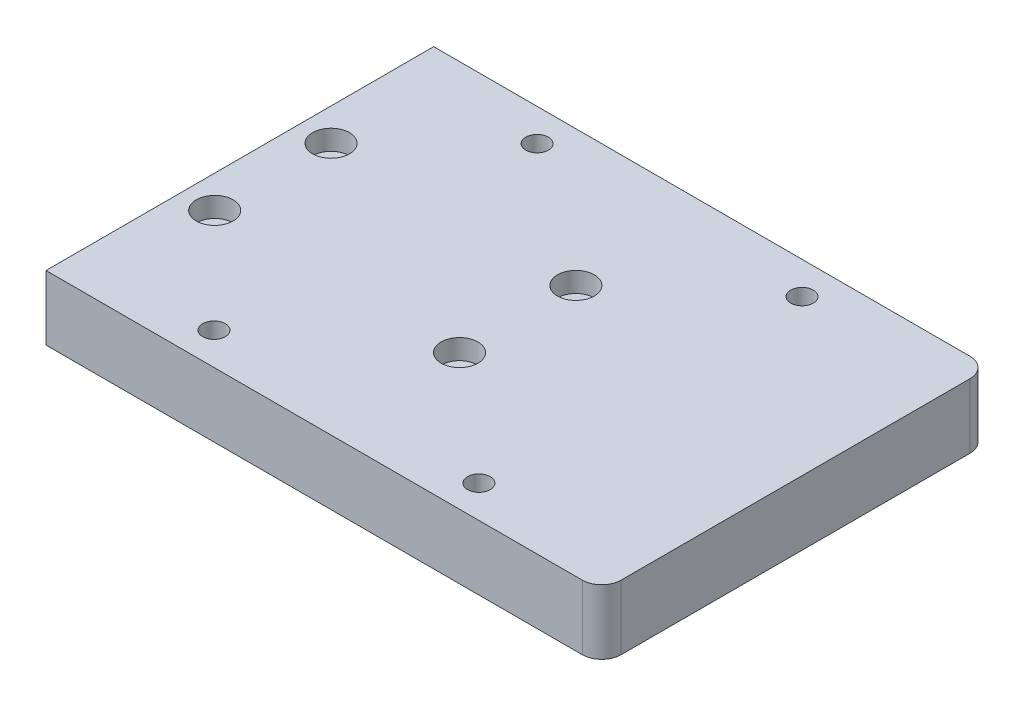
ISO-10303-21;
HEADER;
FILE_DESCRIPTION(('STEP AP214'),'2;1');
FILE_NAME('part.step','',(''),(''),'','','');
FILE_SCHEMA(('AUTOMOTIVE_DESIGN { 1 0 10303 214 1 1 1 1 }'));
ENDSEC;
DATA;
#1=APPLICATION_CONTEXT('core data for automotive mechanical design processes');
#2=APPLICATION_PROTOCOL_DEFINITION('international standard','automotive_design',2000,#1);
#3=PRODUCT_CONTEXT('',#1,'mechanical');
#4=PRODUCT('Part','Part','',(#3));
#5=PRODUCT_RELATED_PRODUCT_CATEGORY('part','',(#4));
#6=PRODUCT_DEFINITION_FORMATION('','',#4);
#7=PRODUCT_DEFINITION_CONTEXT('part definition',#1,'design');
#8=PRODUCT_DEFINITION('design','',#6,#7);
#9=PRODUCT_DEFINITION_SHAPE('','',#8);
#10=(LENGTH_UNIT() NAMED_UNIT(*) SI_UNIT(.MILLI.,.METRE.));
#11=(NAMED_UNIT(*) PLANE_ANGLE_UNIT() SI_UNIT($,.RADIAN.));
#12=(NAMED_UNIT(*) SI_UNIT($,.STERADIAN.) SOLID_ANGLE_UNIT());
#13=UNCERTAINTY_MEASURE_WITH_UNIT(LENGTH_MEASURE(1.E-05),#10,'distance_accuracy_value','');
#14=(GEOMETRIC_REPRESENTATION_CONTEXT(3) GLOBAL_UNCERTAINTY_ASSIGNED_CONTEXT((#13)) GLOBAL_UNIT_ASSIGNED_CONTEXT((#10,
#11,#12)) REPRESENTATION_CONTEXT('',''));
#15=CARTESIAN_POINT('',(0.,0.,0.));
#16=DIRECTION('',(0.,0.,1.));
#17=DIRECTION('',(1.,0.,0.));
#18=AXIS2_PLACEMENT_3D('',#15,#16,#17);
#19=CARTESIAN_POINT('',(-38.,0.,8.88983487013223));
#20=DIRECTION('',(0.,1.,0.));
#21=DIRECTION('',(0.,0.,1.));
#22=AXIS2_PLACEMENT_3D('',#19,#20,#21);
#23=CYLINDRICAL_SURFACE('',#22,1.25);
#24=CARTESIAN_POINT('',(-38.,0.,8.88983487013223));
#25=DIRECTION('',(0.,1.,0.));
#26=DIRECTION('',(0.,0.,1.));
#27=AXIS2_PLACEMENT_3D('',#24,#25,#26);
#28=CIRCLE('',#27,1.25);
#29=CARTESIAN_POINT('',(-38.,0.,10.1398348701322));
#30=VERTEX_POINT('',#29);
#31=EDGE_CURVE('E134',#30,#30,#28,.T.);
#32=ORIENTED_EDGE('',*,*,#31,.F.);
#33=EDGE_LOOP('',(#32));
#34=FACE_BOUND('',#33,.T.);
#35=CARTESIAN_POINT('',(-38.,6.9,8.88983487013223));
#36=DIRECTION('',(0.,1.,0.));
#37=DIRECTION('',(0.,0.,1.));
#38=AXIS2_PLACEMENT_3D('',#35,#36,#37);
#39=CIRCLE('',#38,1.25);
#40=CARTESIAN_POINT('',(-38.,6.9,10.1398348701322));
#41=VERTEX_POINT('',#40);
#42=EDGE_CURVE('E51',#41,#41,#39,.F.);
#43=ORIENTED_EDGE('',*,*,#42,.F.);
#44=EDGE_LOOP('',(#43));
#45=FACE_BOUND('',#44,.T.);
#46=ADVANCED_FACE('F47',(#34,#45),#23,.F.);
#47=CARTESIAN_POINT('',(-38.,0.,-9.11016512986808));
#48=DIRECTION('',(0.,1.,0.));
#49=DIRECTION('',(0.,0.,1.));
#50=AXIS2_PLACEMENT_3D('',#47,#48,#49);
#51=CYLINDRICAL_SURFACE('',#50,1.25);
#52=CARTESIAN_POINT('',(-38.,0.,-9.11016512986808));
#53=DIRECTION('',(0.,1.,0.));
#54=DIRECTION('',(0.,0.,1.));
#55=AXIS2_PLACEMENT_3D('',#52,#53,#54);
#56=CIRCLE('',#55,1.25);
#57=CARTESIAN_POINT('',(-38.,0.,-7.86016512986808));
#58=VERTEX_POINT('',#57);
#59=EDGE_CURVE('E173',#58,#58,#56,.T.);
#60=ORIENTED_EDGE('',*,*,#59,.F.);
#61=EDGE_LOOP('',(#60));
#62=FACE_BOUND('',#61,.T.);
#63=CARTESIAN_POINT('',(-38.,6.9,-9.11016512986808));
#64=DIRECTION('',(0.,1.,0.));
#65=DIRECTION('',(0.,0.,1.));
#66=AXIS2_PLACEMENT_3D('',#63,#64,#65);
#67=CIRCLE('',#66,1.25);
#68=CARTESIAN_POINT('',(-38.,6.9,-7.86016512986808));
#69=VERTEX_POINT('',#68);
#70=EDGE_CURVE('E159',#69,#69,#67,.F.);
#71=ORIENTED_EDGE('',*,*,#70,.F.);
#72=EDGE_LOOP('',(#71));
#73=FACE_BOUND('',#72,.T.);
#74=ADVANCED_FACE('F201',(#62,#73),#51,.F.);
#75=CARTESIAN_POINT('',(0.,0.,-9.00000000000002));
#76=DIRECTION('',(0.,1.,0.));
#77=DIRECTION('',(0.,0.,1.));
#78=AXIS2_PLACEMENT_3D('',#75,#76,#77);
#79=CYLINDRICAL_SURFACE('',#78,1.25);
#80=CARTESIAN_POINT('',(0.,0.,-9.00000000000002));
#81=DIRECTION('',(0.,1.,0.));
#82=DIRECTION('',(0.,0.,1.));
#83=AXIS2_PLACEMENT_3D('',#80,#81,#82);
#84=CIRCLE('',#83,1.25);
#85=CARTESIAN_POINT('',(0.,0.,-7.75000000000002));
#86=VERTEX_POINT('',#85);
#87=EDGE_CURVE('E168',#86,#86,#84,.T.);
#88=ORIENTED_EDGE('',*,*,#87,.F.);
#89=EDGE_LOOP('',(#88));
#90=FACE_BOUND('',#89,.T.);
#91=CARTESIAN_POINT('',(0.,6.9,-9.00000000000002));
#92=DIRECTION('',(0.,1.,0.));
#93=DIRECTION('',(0.,0.,1.));
#94=AXIS2_PLACEMENT_3D('',#91,#92,#93);
#95=CIRCLE('',#94,1.25);
#96=CARTESIAN_POINT('',(0.,6.9,-7.75000000000002));
#97=VERTEX_POINT('',#96);
#98=EDGE_CURVE('E156',#97,#97,#95,.F.);
#99=ORIENTED_EDGE('',*,*,#98,.F.);
#100=EDGE_LOOP('',(#99));
#101=FACE_BOUND('',#100,.T.);
#102=ADVANCED_FACE('F197',(#90,#101),#79,.F.);
#103=CARTESIAN_POINT('',(0.,0.,8.99999999999963));
#104=DIRECTION('',(0.,1.,0.));
#105=DIRECTION('',(0.,0.,1.));
#106=AXIS2_PLACEMENT_3D('',#103,#104,#105);
#107=CYLINDRICAL_SURFACE('',#106,1.25);
#108=CARTESIAN_POINT('',(0.,0.,8.99999999999963));
#109=DIRECTION('',(0.,1.,0.));
#110=DIRECTION('',(0.,0.,1.));
#111=AXIS2_PLACEMENT_3D('',#108,#109,#110);
#112=CIRCLE('',#111,1.25);
#113=CARTESIAN_POINT('',(0.,0.,10.2499999999996));
#114=VERTEX_POINT('',#113);
#115=EDGE_CURVE('E164',#114,#114,#112,.T.);
#116=ORIENTED_EDGE('',*,*,#115,.F.);
#117=EDGE_LOOP('',(#116));
#118=FACE_BOUND('',#117,.T.);
#119=CARTESIAN_POINT('',(0.,6.9,8.99999999999963));
#120=DIRECTION('',(0.,1.,0.));
#121=DIRECTION('',(0.,0.,1.));
#122=AXIS2_PLACEMENT_3D('',#119,#120,#121);
#123=CIRCLE('',#122,1.25);
#124=CARTESIAN_POINT('',(0.,6.9,10.2499999999996));
#125=VERTEX_POINT('',#124);
#126=EDGE_CURVE('E153',#125,#125,#123,.F.);
#127=ORIENTED_EDGE('',*,*,#126,.F.);
#128=EDGE_LOOP('',(#127));
#129=FACE_BOUND('',#128,.T.);
#130=ADVANCED_FACE('F190',(#118,#129),#107,.F.);
#131=CARTESIAN_POINT('',(43.,10.,-30.));
#132=DIRECTION('',(-1.,0.,0.));
#133=DIRECTION('',(0.,0.,1.));
#134=AXIS2_PLACEMENT_3D('',#131,#132,#133);
#135=PLANE('',#134);
#136=DIRECTION('',(0.,0.,-1.));
#137=VECTOR('',#136,1.);
#138=CARTESIAN_POINT('',(43.,0.,-30.));
#139=LINE('',#138,#137);
#140=CARTESIAN_POINT('',(43.,0.,27.));
#141=VERTEX_POINT('',#140);
#142=CARTESIAN_POINT('',(43.,0.,-27.));
#143=VERTEX_POINT('',#142);
#144=EDGE_CURVE('E132',#141,#143,#139,.T.);
#145=ORIENTED_EDGE('',*,*,#144,.T.);
#146=DIRECTION('',(0.,-1.,0.));
#147=VECTOR('',#146,1.);
#148=CARTESIAN_POINT('',(43.,10.,-27.));
#149=LINE('',#148,#147);
#150=CARTESIAN_POINT('',(43.,10.,-27.));
#151=VERTEX_POINT('',#150);
#152=EDGE_CURVE('E70',#143,#151,#149,.F.);
#153=ORIENTED_EDGE('',*,*,#152,.T.);
#154=DIRECTION('',(0.,0.,-1.));
#155=VECTOR('',#154,1.);
#156=CARTESIAN_POINT('',(43.,10.,-30.));
#157=LINE('',#156,#155);
#158=CARTESIAN_POINT('',(43.,10.,27.));
#159=VERTEX_POINT('',#158);
#160=EDGE_CURVE('E113',#159,#151,#157,.T.);
#161=ORIENTED_EDGE('',*,*,#160,.F.);
#162=DIRECTION('',(0.,-1.,0.));
#163=VECTOR('',#162,1.);
#164=CARTESIAN_POINT('',(43.,10.,27.));
#165=LINE('',#164,#163);
#166=EDGE_CURVE('E146',#159,#141,#165,.T.);
#167=ORIENTED_EDGE('',*,*,#166,.T.);
#168=EDGE_LOOP('',(#145,#153,#161,#167));
#169=FACE_BOUND('',#168,.T.);
#170=ADVANCED_FACE('F188',(#169),#135,.F.);
#171=CARTESIAN_POINT('',(-43.,10.,-30.));
#172=DIRECTION('',(0.,0.,1.));
#173=DIRECTION('',(1.,0.,0.));
#174=AXIS2_PLACEMENT_3D('',#171,#172,#173);
#175=PLANE('',#174);
#176=DIRECTION('',(-1.,0.,0.));
#177=VECTOR('',#176,1.);
#178=CARTESIAN_POINT('',(-43.,10.,-30.));
#179=LINE('',#178,#177);
#180=CARTESIAN_POINT('',(40.,10.,-30.));
#181=VERTEX_POINT('',#180);
#182=CARTESIAN_POINT('',(-43.,10.,-30.));
#183=VERTEX_POINT('',#182);
#184=EDGE_CURVE('E103',#181,#183,#179,.T.);
#185=ORIENTED_EDGE('',*,*,#184,.F.);
#186=DIRECTION('',(0.,-1.,0.));
#187=VECTOR('',#186,1.);
#188=CARTESIAN_POINT('',(40.,10.,-30.));
#189=LINE('',#188,#187);
#190=CARTESIAN_POINT('',(40.,0.,-30.));
#191=VERTEX_POINT('',#190);
#192=EDGE_CURVE('E122',#181,#191,#189,.T.);
#193=ORIENTED_EDGE('',*,*,#192,.T.);
#194=DIRECTION('',(-1.,0.,0.));
#195=VECTOR('',#194,1.);
#196=CARTESIAN_POINT('',(-43.,0.,-30.));
#197=LINE('',#196,#195);
#198=CARTESIAN_POINT('',(-43.,0.,-30.));
#199=VERTEX_POINT('',#198);
#200=EDGE_CURVE('E119',#191,#199,#197,.T.);
#201=ORIENTED_EDGE('',*,*,#200,.T.);
#202=DIRECTION('',(0.,-1.,0.));
#203=VECTOR('',#202,1.);
#204=CARTESIAN_POINT('',(-43.,10.,-30.));
#205=LINE('',#204,#203);
#206=EDGE_CURVE('E116',#183,#199,#205,.T.);
#207=ORIENTED_EDGE('',*,*,#206,.F.);
#208=EDGE_LOOP('',(#185,#193,#201,#207));
#209=FACE_BOUND('',#208,.T.);
#210=ADVANCED_FACE('F117',(#209),#175,.F.);
#211=CARTESIAN_POINT('',(-43.,10.,-30.));
#212=DIRECTION('',(1.,0.,0.));
#213=DIRECTION('',(0.,0.,-1.));
#214=AXIS2_PLACEMENT_3D('',#211,#212,#213);
#215=PLANE('',#214);
#216=DIRECTION('',(0.,0.,1.));
#217=VECTOR('',#216,1.);
#218=CARTESIAN_POINT('',(-43.,0.,-30.));
#219=LINE('',#218,#217);
#220=CARTESIAN_POINT('',(-43.,0.,30.));
#221=VERTEX_POINT('',#220);
#222=EDGE_CURVE('E136',#199,#221,#219,.T.);
#223=ORIENTED_EDGE('',*,*,#222,.T.);
#224=DIRECTION('',(0.,-1.,0.));
#225=VECTOR('',#224,1.);
#226=CARTESIAN_POINT('',(-43.,10.,30.));
#227=LINE('',#226,#225);
#228=CARTESIAN_POINT('',(-43.,10.,30.));
#229=VERTEX_POINT('',#228);
#230=EDGE_CURVE('E123',#229,#221,#227,.T.);
#231=ORIENTED_EDGE('',*,*,#230,.F.);
#232=DIRECTION('',(0.,0.,1.));
#233=VECTOR('',#232,1.);
#234=CARTESIAN_POINT('',(-43.,10.,-30.));
#235=LINE('',#234,#233);
#236=EDGE_CURVE('E107',#183,#229,#235,.T.);
#237=ORIENTED_EDGE('',*,*,#236,.F.);
#238=ORIENTED_EDGE('',*,*,#206,.T.);
#239=EDGE_LOOP('',(#223,#231,#237,#238));
#240=FACE_BOUND('',#239,.T.);
#241=ADVANCED_FACE('F125',(#240),#215,.F.);
#242=CARTESIAN_POINT('',(-43.,10.,30.));
#243=DIRECTION('',(0.,0.,-1.));
#244=DIRECTION('',(-1.,0.,0.));
#245=AXIS2_PLACEMENT_3D('',#242,#243,#244);
#246=PLANE('',#245);
#247=DIRECTION('',(1.,0.,0.));
#248=VECTOR('',#247,1.);
#249=CARTESIAN_POINT('',(-43.,0.,30.));
#250=LINE('',#249,#248);
#251=CARTESIAN_POINT('',(40.,0.,30.));
#252=VERTEX_POINT('',#251);
#253=EDGE_CURVE('E138',#221,#252,#250,.T.);
#254=ORIENTED_EDGE('',*,*,#253,.T.);
#255=DIRECTION('',(0.,-1.,0.));
#256=VECTOR('',#255,1.);
#257=CARTESIAN_POINT('',(40.,10.,30.));
#258=LINE('',#257,#256);
#259=CARTESIAN_POINT('',(40.,10.,30.));
#260=VERTEX_POINT('',#259);
#261=EDGE_CURVE('E13',#252,#260,#258,.F.);
#262=ORIENTED_EDGE('',*,*,#261,.T.);
#263=DIRECTION('',(1.,0.,0.));
#264=VECTOR('',#263,1.);
#265=CARTESIAN_POINT('',(-43.,10.,30.));
#266=LINE('',#265,#264);
#267=EDGE_CURVE('E127',#229,#260,#266,.T.);
#268=ORIENTED_EDGE('',*,*,#267,.F.);
#269=ORIENTED_EDGE('',*,*,#230,.T.);
#270=EDGE_LOOP('',(#254,#262,#268,#269));
#271=FACE_BOUND('',#270,.T.);
#272=ADVANCED_FACE('F186',(#271),#246,.F.);
#273=CARTESIAN_POINT('',(0.,10.,0.));
#274=DIRECTION('',(0.,1.,0.));
#275=DIRECTION('',(0.,0.,1.));
#276=AXIS2_PLACEMENT_3D('',#273,#274,#275);
#277=PLANE('',#276);
#278=CARTESIAN_POINT('',(-22.,10.,-25.));
#279=DIRECTION('',(0.,1.,0.));
#280=DIRECTION('',(0.,0.,1.));
#281=AXIS2_PLACEMENT_3D('',#278,#279,#280);
#282=CIRCLE('',#281,1.75);
#283=CARTESIAN_POINT('',(-22.,10.,-23.25));
#284=VERTEX_POINT('',#283);
#285=EDGE_CURVE('E461',#284,#284,#282,.T.);
#286=ORIENTED_EDGE('',*,*,#285,.F.);
#287=EDGE_LOOP('',(#286));
#288=FACE_BOUND('',#287,.T.);
#289=CARTESIAN_POINT('',(19.,10.,25.));
#290=DIRECTION('',(0.,1.,0.));
#291=DIRECTION('',(0.,0.,1.));
#292=AXIS2_PLACEMENT_3D('',#289,#290,#291);
#293=CIRCLE('',#292,1.75);
#294=CARTESIAN_POINT('',(19.,10.,26.75));
#295=VERTEX_POINT('',#294);
#296=EDGE_CURVE('E454',#295,#295,#293,.T.);
#297=ORIENTED_EDGE('',*,*,#296,.F.);
#298=EDGE_LOOP('',(#297));
#299=FACE_BOUND('',#298,.T.);
#300=CARTESIAN_POINT('',(19.,10.,-25.));
#301=DIRECTION('',(0.,1.,0.));
#302=DIRECTION('',(0.,0.,1.));
#303=AXIS2_PLACEMENT_3D('',#300,#301,#302);
#304=CIRCLE('',#303,1.75);
#305=CARTESIAN_POINT('',(19.,10.,-23.25));
#306=VERTEX_POINT('',#305);
#307=EDGE_CURVE('E466',#306,#306,#304,.T.);
#308=ORIENTED_EDGE('',*,*,#307,.F.);
#309=EDGE_LOOP('',(#308));
#310=FACE_BOUND('',#309,.T.);
#311=CARTESIAN_POINT('',(-22.,10.,25.));
#312=DIRECTION('',(0.,1.,0.));
#313=DIRECTION('',(0.,0.,1.));
#314=AXIS2_PLACEMENT_3D('',#311,#312,#313);
#315=CIRCLE('',#314,1.75);
#316=CARTESIAN_POINT('',(-22.,10.,26.75));
#317=VERTEX_POINT('',#316);
#318=EDGE_CURVE('E448',#317,#317,#315,.T.);
#319=ORIENTED_EDGE('',*,*,#318,.F.);
#320=EDGE_LOOP('',(#319));
#321=FACE_BOUND('',#320,.T.);
#322=CARTESIAN_POINT('',(-38.,10.,-9.11016512986808));
#323=DIRECTION('',(0.,1.,0.));
#324=DIRECTION('',(0.,0.,1.));
#325=AXIS2_PLACEMENT_3D('',#322,#323,#324);
#326=CIRCLE('',#325,2.85);
#327=CARTESIAN_POINT('',(-38.,10.,-6.26016512986808));
#328=VERTEX_POINT('',#327);
#329=EDGE_CURVE('E437',#328,#328,#326,.T.);
#330=ORIENTED_EDGE('',*,*,#329,.F.);
#331=EDGE_LOOP('',(#330));
#332=FACE_BOUND('',#331,.T.);
#333=CARTESIAN_POINT('',(0.,10.,8.99999999999963));
#334=DIRECTION('',(0.,1.,0.));
#335=DIRECTION('',(0.,0.,1.));
#336=AXIS2_PLACEMENT_3D('',#333,#334,#335);
#337=CIRCLE('',#336,2.85);
#338=CARTESIAN_POINT('',(0.,10.,11.8499999999996));
#339=VERTEX_POINT('',#338);
#340=EDGE_CURVE('E430',#339,#339,#337,.T.);
#341=ORIENTED_EDGE('',*,*,#340,.F.);
#342=EDGE_LOOP('',(#341));
#343=FACE_BOUND('',#342,.T.);
#344=CARTESIAN_POINT('',(0.,10.,-9.00000000000002));
#345=DIRECTION('',(0.,1.,0.));
#346=DIRECTION('',(0.,0.,1.));
#347=AXIS2_PLACEMENT_3D('',#344,#345,#346);
#348=CIRCLE('',#347,2.85);
#349=CARTESIAN_POINT('',(0.,10.,-6.15000000000002));
#350=VERTEX_POINT('',#349);
#351=EDGE_CURVE('E442',#350,#350,#348,.T.);
#352=ORIENTED_EDGE('',*,*,#351,.F.);
#353=EDGE_LOOP('',(#352));
#354=FACE_BOUND('',#353,.T.);
#355=CARTESIAN_POINT('',(-38.,10.,8.88983487013223));
#356=DIRECTION('',(0.,1.,0.));
#357=DIRECTION('',(0.,0.,1.));
#358=AXIS2_PLACEMENT_3D('',#355,#356,#357);
#359=CIRCLE('',#358,2.85);
#360=CARTESIAN_POINT('',(-38.,10.,11.7398348701322));
#361=VERTEX_POINT('',#360);
#362=EDGE_CURVE('E424',#361,#361,#359,.T.);
#363=ORIENTED_EDGE('',*,*,#362,.F.);
#364=EDGE_LOOP('',(#363));
#365=FACE_BOUND('',#364,.T.);
#366=ORIENTED_EDGE('',*,*,#160,.T.);
#367=CARTESIAN_POINT('',(40.,10.,-27.));
#368=DIRECTION('',(0.,1.,0.));
#369=DIRECTION('',(0.,0.,1.));
#370=AXIS2_PLACEMENT_3D('',#367,#368,#369);
#371=CIRCLE('',#370,3.);
#372=EDGE_CURVE('E56',#151,#181,#371,.T.);
#373=ORIENTED_EDGE('',*,*,#372,.T.);
#374=ORIENTED_EDGE('',*,*,#184,.T.);
#375=ORIENTED_EDGE('',*,*,#236,.T.);
#376=ORIENTED_EDGE('',*,*,#267,.T.);
#377=CARTESIAN_POINT('',(40.,10.,27.));
#378=DIRECTION('',(0.,1.,0.));
#379=DIRECTION('',(0.,0.,1.));
#380=AXIS2_PLACEMENT_3D('',#377,#378,#379);
#381=CIRCLE('',#380,3.);
#382=EDGE_CURVE('E150',#260,#159,#381,.T.);
#383=ORIENTED_EDGE('',*,*,#382,.T.);
#384=EDGE_LOOP('',(#366,#373,#374,#375,#376,#383));
#385=FACE_BOUND('',#384,.T.);
#386=ADVANCED_FACE('F105',(#288,#299,#310,#321,#332,#343,#354,#365,#385),#277,.T.);
#387=CARTESIAN_POINT('',(0.,0.,0.));
#388=DIRECTION('',(0.,1.,0.));
#389=DIRECTION('',(0.,0.,1.));
#390=AXIS2_PLACEMENT_3D('',#387,#388,#389);
#391=PLANE('',#390);
#392=CARTESIAN_POINT('',(-22.,0.,-25.));
#393=DIRECTION('',(0.,1.,0.));
#394=DIRECTION('',(0.,0.,1.));
#395=AXIS2_PLACEMENT_3D('',#392,#393,#394);
#396=CIRCLE('',#395,1.75);
#397=CARTESIAN_POINT('',(-22.,0.,-23.25));
#398=VERTEX_POINT('',#397);
#399=EDGE_CURVE('E451',#398,#398,#396,.T.);
#400=ORIENTED_EDGE('',*,*,#399,.T.);
#401=EDGE_LOOP('',(#400));
#402=FACE_BOUND('',#401,.T.);
#403=CARTESIAN_POINT('',(19.,0.,25.));
#404=DIRECTION('',(0.,1.,0.));
#405=DIRECTION('',(0.,0.,1.));
#406=AXIS2_PLACEMENT_3D('',#403,#404,#405);
#407=CIRCLE('',#406,1.75);
#408=CARTESIAN_POINT('',(19.,0.,26.75));
#409=VERTEX_POINT('',#408);
#410=EDGE_CURVE('E457',#409,#409,#407,.T.);
#411=ORIENTED_EDGE('',*,*,#410,.T.);
#412=EDGE_LOOP('',(#411));
#413=FACE_BOUND('',#412,.T.);
#414=CARTESIAN_POINT('',(19.,0.,-25.));
#415=DIRECTION('',(0.,1.,0.));
#416=DIRECTION('',(0.,0.,1.));
#417=AXIS2_PLACEMENT_3D('',#414,#415,#416);
#418=CIRCLE('',#417,1.75);
#419=CARTESIAN_POINT('',(19.,0.,-23.25));
#420=VERTEX_POINT('',#419);
#421=EDGE_CURVE('E458',#420,#420,#418,.T.);
#422=ORIENTED_EDGE('',*,*,#421,.T.);
#423=EDGE_LOOP('',(#422));
#424=FACE_BOUND('',#423,.T.);
#425=CARTESIAN_POINT('',(-22.,0.,25.));
#426=DIRECTION('',(0.,1.,0.));
#427=DIRECTION('',(0.,0.,1.));
#428=AXIS2_PLACEMENT_3D('',#425,#426,#427);
#429=CIRCLE('',#428,1.75);
#430=CARTESIAN_POINT('',(-22.,0.,26.75));
#431=VERTEX_POINT('',#430);
#432=EDGE_CURVE('E445',#431,#431,#429,.T.);
#433=ORIENTED_EDGE('',*,*,#432,.T.);
#434=EDGE_LOOP('',(#433));
#435=FACE_BOUND('',#434,.T.);
#436=ORIENTED_EDGE('',*,*,#115,.T.);
#437=EDGE_LOOP('',(#436));
#438=FACE_BOUND('',#437,.T.);
#439=ORIENTED_EDGE('',*,*,#87,.T.);
#440=EDGE_LOOP('',(#439));
#441=FACE_BOUND('',#440,.T.);
#442=ORIENTED_EDGE('',*,*,#59,.T.);
#443=EDGE_LOOP('',(#442));
#444=FACE_BOUND('',#443,.T.);
#445=ORIENTED_EDGE('',*,*,#31,.T.);
#446=EDGE_LOOP('',(#445));
#447=FACE_BOUND('',#446,.T.);
#448=ORIENTED_EDGE('',*,*,#200,.F.);
#449=CARTESIAN_POINT('',(40.,0.,-27.));
#450=DIRECTION('',(0.,1.,0.));
#451=DIRECTION('',(0.,0.,1.));
#452=AXIS2_PLACEMENT_3D('',#449,#450,#451);
#453=CIRCLE('',#452,3.);
#454=EDGE_CURVE('E144',#191,#143,#453,.F.);
#455=ORIENTED_EDGE('',*,*,#454,.T.);
#456=ORIENTED_EDGE('',*,*,#144,.F.);
#457=CARTESIAN_POINT('',(40.,0.,27.));
#458=DIRECTION('',(0.,1.,0.));
#459=DIRECTION('',(0.,0.,1.));
#460=AXIS2_PLACEMENT_3D('',#457,#458,#459);
#461=CIRCLE('',#460,3.);
#462=EDGE_CURVE('E142',#141,#252,#461,.F.);
#463=ORIENTED_EDGE('',*,*,#462,.T.);
#464=ORIENTED_EDGE('',*,*,#253,.F.);
#465=ORIENTED_EDGE('',*,*,#222,.F.);
#466=EDGE_LOOP('',(#448,#455,#456,#463,#464,#465));
#467=FACE_BOUND('',#466,.T.);
#468=ADVANCED_FACE('F183',(#402,#413,#424,#435,#438,#441,#444,#447,#467),#391,.F.);
#469=CARTESIAN_POINT('',(40.,10.,-27.));
#470=DIRECTION('',(0.,-1.,0.));
#471=DIRECTION('',(0.,0.,-1.));
#472=AXIS2_PLACEMENT_3D('',#469,#470,#471);
#473=CYLINDRICAL_SURFACE('',#472,3.);
#474=ORIENTED_EDGE('',*,*,#372,.F.);
#475=ORIENTED_EDGE('',*,*,#152,.F.);
#476=ORIENTED_EDGE('',*,*,#454,.F.);
#477=ORIENTED_EDGE('',*,*,#192,.F.);
#478=EDGE_LOOP('',(#474,#475,#476,#477));
#479=FACE_BOUND('',#478,.T.);
#480=ADVANCED_FACE('F181',(#479),#473,.T.);
#481=CARTESIAN_POINT('',(40.,10.,27.));
#482=DIRECTION('',(0.,-1.,0.));
#483=DIRECTION('',(0.,0.,-1.));
#484=AXIS2_PLACEMENT_3D('',#481,#482,#483);
#485=CYLINDRICAL_SURFACE('',#484,3.);
#486=ORIENTED_EDGE('',*,*,#382,.F.);
#487=ORIENTED_EDGE('',*,*,#261,.F.);
#488=ORIENTED_EDGE('',*,*,#462,.F.);
#489=ORIENTED_EDGE('',*,*,#166,.F.);
#490=EDGE_LOOP('',(#486,#487,#488,#489));
#491=FACE_BOUND('',#490,.T.);
#492=ADVANCED_FACE('F49',(#491),#485,.T.);
#493=CARTESIAN_POINT('',(0.,6.9,8.99999999999963));
#494=DIRECTION('',(0.,1.,0.));
#495=DIRECTION('',(0.,0.,1.));
#496=AXIS2_PLACEMENT_3D('',#493,#494,#495);
#497=PLANE('',#496);
#498=CARTESIAN_POINT('',(0.,6.9,8.99999999999963));
#499=DIRECTION('',(0.,1.,0.));
#500=DIRECTION('',(0.,0.,1.));
#501=AXIS2_PLACEMENT_3D('',#498,#499,#500);
#502=CIRCLE('',#501,2.85);
#503=CARTESIAN_POINT('',(0.,6.9,11.8499999999996));
#504=VERTEX_POINT('',#503);
#505=EDGE_CURVE('E433',#504,#504,#502,.T.);
#506=ORIENTED_EDGE('',*,*,#505,.T.);
#507=EDGE_LOOP('',(#506));
#508=FACE_BOUND('',#507,.T.);
#509=ORIENTED_EDGE('',*,*,#126,.T.);
#510=EDGE_LOOP('',(#509));
#511=FACE_BOUND('',#510,.T.);
#512=ADVANCED_FACE('F251',(#508,#511),#497,.T.);
#513=CARTESIAN_POINT('',(0.,6.9,8.99999999999963));
#514=DIRECTION('',(0.,1.,0.));
#515=DIRECTION('',(0.,0.,1.));
#516=AXIS2_PLACEMENT_3D('',#513,#514,#515);
#517=CYLINDRICAL_SURFACE('',#516,2.85);
#518=CARTESIAN_POINT('',(0.,6.9,11.8499999999996));
#519=CARTESIAN_POINT('',(0.,6.93229166666667,11.8499999999996));
#520=CARTESIAN_POINT('',(0.,6.96458333333333,11.8499999999996));
#521=CARTESIAN_POINT('',(0.,7.02916666666667,11.8499999999996));
#522=CARTESIAN_POINT('',(0.,7.06145833333333,11.8499999999996));
#523=CARTESIAN_POINT('',(0.,7.12604166666667,11.8499999999996));
#524=CARTESIAN_POINT('',(0.,7.15833333333333,11.8499999999996));
#525=CARTESIAN_POINT('',(0.,7.22291666666667,11.8499999999996));
#526=CARTESIAN_POINT('',(0.,7.25520833333333,11.8499999999996));
#527=CARTESIAN_POINT('',(0.,7.31979166666667,11.8499999999996));
#528=CARTESIAN_POINT('',(0.,7.35208333333333,11.8499999999996));
#529=CARTESIAN_POINT('',(0.,7.41666666666667,11.8499999999996));
#530=CARTESIAN_POINT('',(0.,7.44895833333333,11.8499999999996));
#531=CARTESIAN_POINT('',(0.,7.51354166666667,11.8499999999996));
#532=CARTESIAN_POINT('',(0.,7.54583333333333,11.8499999999996));
#533=CARTESIAN_POINT('',(0.,7.61041666666667,11.8499999999996));
#534=CARTESIAN_POINT('',(0.,7.64270833333333,11.8499999999996));
#535=CARTESIAN_POINT('',(0.,7.70729166666667,11.8499999999996));
#536=CARTESIAN_POINT('',(0.,7.73958333333333,11.8499999999996));
#537=CARTESIAN_POINT('',(0.,7.80416666666667,11.8499999999996));
#538=CARTESIAN_POINT('',(0.,7.83645833333333,11.8499999999996));
#539=CARTESIAN_POINT('',(0.,7.90104166666667,11.8499999999996));
#540=CARTESIAN_POINT('',(0.,7.93333333333333,11.8499999999996));
#541=CARTESIAN_POINT('',(0.,7.99791666666667,11.8499999999996));
#542=CARTESIAN_POINT('',(0.,8.03020833333333,11.8499999999996));
#543=CARTESIAN_POINT('',(0.,8.09479166666667,11.8499999999996));
#544=CARTESIAN_POINT('',(0.,8.12708333333333,11.8499999999996));
#545=CARTESIAN_POINT('',(0.,8.19166666666667,11.8499999999996));
#546=CARTESIAN_POINT('',(0.,8.22395833333333,11.8499999999996));
#547=CARTESIAN_POINT('',(0.,8.28854166666667,11.8499999999996));
#548=CARTESIAN_POINT('',(0.,8.32083333333333,11.8499999999996));
#549=CARTESIAN_POINT('',(0.,8.38541666666667,11.8499999999996));
#550=CARTESIAN_POINT('',(0.,8.41770833333333,11.8499999999996));
#551=CARTESIAN_POINT('',(0.,8.48229166666667,11.8499999999996));
#552=CARTESIAN_POINT('',(0.,8.51458333333333,11.8499999999996));
#553=CARTESIAN_POINT('',(0.,8.57916666666667,11.8499999999996));
#554=CARTESIAN_POINT('',(0.,8.61145833333333,11.8499999999996));
#555=CARTESIAN_POINT('',(0.,8.67604166666667,11.8499999999996));
#556=CARTESIAN_POINT('',(0.,8.70833333333333,11.8499999999996));
#557=CARTESIAN_POINT('',(0.,8.77291666666667,11.8499999999996));
#558=CARTESIAN_POINT('',(0.,8.80520833333333,11.8499999999996));
#559=CARTESIAN_POINT('',(0.,8.86979166666667,11.8499999999996));
#560=CARTESIAN_POINT('',(0.,8.90208333333333,11.8499999999996));
#561=CARTESIAN_POINT('',(0.,8.96666666666667,11.8499999999996));
#562=CARTESIAN_POINT('',(0.,8.99895833333333,11.8499999999996));
#563=CARTESIAN_POINT('',(0.,9.06354166666667,11.8499999999996));
#564=CARTESIAN_POINT('',(0.,9.09583333333333,11.8499999999996));
#565=CARTESIAN_POINT('',(0.,9.16041666666667,11.8499999999996));
#566=CARTESIAN_POINT('',(0.,9.19270833333333,11.8499999999996));
#567=CARTESIAN_POINT('',(0.,9.25729166666667,11.8499999999996));
#568=CARTESIAN_POINT('',(0.,9.28958333333333,11.8499999999996));
#569=CARTESIAN_POINT('',(0.,9.35416666666667,11.8499999999996));
#570=CARTESIAN_POINT('',(0.,9.38645833333333,11.8499999999996));
#571=CARTESIAN_POINT('',(0.,9.45104166666667,11.8499999999996));
#572=CARTESIAN_POINT('',(0.,9.48333333333333,11.8499999999996));
#573=CARTESIAN_POINT('',(0.,9.54791666666667,11.8499999999996));
#574=CARTESIAN_POINT('',(0.,9.58020833333333,11.8499999999996));
#575=CARTESIAN_POINT('',(0.,9.64479166666667,11.8499999999996));
#576=CARTESIAN_POINT('',(0.,9.67708333333333,11.8499999999996));
#577=CARTESIAN_POINT('',(0.,9.74166666666667,11.8499999999996));
#578=CARTESIAN_POINT('',(0.,9.77395833333333,11.8499999999996));
#579=CARTESIAN_POINT('',(0.,9.83854166666667,11.8499999999996));
#580=CARTESIAN_POINT('',(0.,9.87083333333333,11.8499999999996));
#581=CARTESIAN_POINT('',(0.,9.93541666666667,11.8499999999996));
#582=CARTESIAN_POINT('',(0.,9.96770833333333,11.8499999999996));
#583=CARTESIAN_POINT('',(0.,10.,11.8499999999996));
#584=B_SPLINE_CURVE_WITH_KNOTS('',3,(#518,#519,#520,#521,#522,#523,#524,#525,#526,#527,#528,
#529,#530,#531,#532,#533,#534,#535,#536,#537,#538,#539,#540,#541,#542,#543,#544,#545,#546,#547,
#548,#549,#550,#551,#552,#553,#554,#555,#556,#557,#558,#559,#560,#561,#562,#563,#564,#565,#566,
#567,#568,#569,#570,#571,#572,#573,#574,#575,#576,#577,#578,#579,#580,#581,#582,#583),
.UNSPECIFIED.,.F.,.F.,(4,2,2,2,2,2,2,2,2,2,2,2,2,2,2,2,2,2,2,2,2,2,2,2,2,2,2,2,2,2,2,2,4),(0.,
0.0968750000000006,0.19375,0.290625,0.387500000000001,0.484375,0.58125,0.678125000000001,0.775,
0.871875,0.96875,1.065625,1.1625,1.259375,1.35625,1.453125,1.55,1.646875,1.74375,1.840625,
1.9375,2.034375,2.13125,2.228125,2.325,2.421875,2.51875,2.615625,2.7125,2.809375,2.90625,
3.003125,3.1),.UNSPECIFIED.);
#585=EDGE_CURVE('BSEAM257',#504,#339,#584,.T.);
#586=ORIENTED_EDGE('',*,*,#505,.F.);
#587=ORIENTED_EDGE('',*,*,#340,.T.);
#588=ORIENTED_EDGE('',*,*,#585,.T.);
#589=ORIENTED_EDGE('',*,*,#585,.F.);
#590=EDGE_LOOP('',(#586,#588,#587,#589));
#591=FACE_BOUND('',#590,.T.);
#592=ADVANCED_FACE('F257',(#591),#517,.F.);
#593=CARTESIAN_POINT('',(0.,6.9,-9.00000000000002));
#594=DIRECTION('',(0.,1.,0.));
#595=DIRECTION('',(0.,0.,1.));
#596=AXIS2_PLACEMENT_3D('',#593,#594,#595);
#597=PLANE('',#596);
#598=CARTESIAN_POINT('',(0.,6.9,-9.00000000000002));
#599=DIRECTION('',(0.,1.,0.));
#600=DIRECTION('',(0.,0.,1.));
#601=AXIS2_PLACEMENT_3D('',#598,#599,#600);
#602=CIRCLE('',#601,2.85);
#603=CARTESIAN_POINT('',(0.,6.9,-6.15000000000002));
#604=VERTEX_POINT('',#603);
#605=EDGE_CURVE('E434',#604,#604,#602,.T.);
#606=ORIENTED_EDGE('',*,*,#605,.T.);
#607=EDGE_LOOP('',(#606));
#608=FACE_BOUND('',#607,.T.);
#609=ORIENTED_EDGE('',*,*,#98,.T.);
#610=EDGE_LOOP('',(#609));
#611=FACE_BOUND('',#610,.T.);
#612=ADVANCED_FACE('F266',(#608,#611),#597,.T.);
#613=CARTESIAN_POINT('',(0.,6.9,-9.00000000000002));
#614=DIRECTION('',(0.,1.,0.));
#615=DIRECTION('',(0.,0.,1.));
#616=AXIS2_PLACEMENT_3D('',#613,#614,#615);
#617=CYLINDRICAL_SURFACE('',#616,2.85);
#618=CARTESIAN_POINT('',(0.,6.9,-6.15000000000002));
#619=CARTESIAN_POINT('',(0.,6.93229166666667,-6.15000000000002));
#620=CARTESIAN_POINT('',(0.,6.96458333333333,-6.15000000000002));
#621=CARTESIAN_POINT('',(0.,7.02916666666667,-6.15000000000002));
#622=CARTESIAN_POINT('',(0.,7.06145833333333,-6.15000000000002));
#623=CARTESIAN_POINT('',(0.,7.12604166666667,-6.15000000000002));
#624=CARTESIAN_POINT('',(0.,7.15833333333333,-6.15000000000002));
#625=CARTESIAN_POINT('',(0.,7.22291666666667,-6.15000000000002));
#626=CARTESIAN_POINT('',(0.,7.25520833333333,-6.15000000000002));
#627=CARTESIAN_POINT('',(0.,7.31979166666667,-6.15000000000002));
#628=CARTESIAN_POINT('',(0.,7.35208333333333,-6.15000000000002));
#629=CARTESIAN_POINT('',(0.,7.41666666666667,-6.15000000000002));
#630=CARTESIAN_POINT('',(0.,7.44895833333333,-6.15000000000002));
#631=CARTESIAN_POINT('',(0.,7.51354166666667,-6.15000000000002));
#632=CARTESIAN_POINT('',(0.,7.54583333333333,-6.15000000000002));
#633=CARTESIAN_POINT('',(0.,7.61041666666667,-6.15000000000002));
#634=CARTESIAN_POINT('',(0.,7.64270833333333,-6.15000000000002));
#635=CARTESIAN_POINT('',(0.,7.70729166666667,-6.15000000000002));
#636=CARTESIAN_POINT('',(0.,7.73958333333333,-6.15000000000002));
#637=CARTESIAN_POINT('',(0.,7.80416666666667,-6.15000000000002));
#638=CARTESIAN_POINT('',(0.,7.83645833333333,-6.15000000000002));
#639=CARTESIAN_POINT('',(0.,7.90104166666667,-6.15000000000002));
#640=CARTESIAN_POINT('',(0.,7.93333333333333,-6.15000000000002));
#641=CARTESIAN_POINT('',(0.,7.99791666666667,-6.15000000000002));
#642=CARTESIAN_POINT('',(0.,8.03020833333333,-6.15000000000002));
#643=CARTESIAN_POINT('',(0.,8.09479166666667,-6.15000000000002));
#644=CARTESIAN_POINT('',(0.,8.12708333333333,-6.15000000000002));
#645=CARTESIAN_POINT('',(0.,8.19166666666667,-6.15000000000002));
#646=CARTESIAN_POINT('',(0.,8.22395833333333,-6.15000000000002));
#647=CARTESIAN_POINT('',(0.,8.28854166666667,-6.15000000000002));
#648=CARTESIAN_POINT('',(0.,8.32083333333333,-6.15000000000002));
#649=CARTESIAN_POINT('',(0.,8.38541666666667,-6.15000000000002));
#650=CARTESIAN_POINT('',(0.,8.41770833333333,-6.15000000000002));
#651=CARTESIAN_POINT('',(0.,8.48229166666667,-6.15000000000002));
#652=CARTESIAN_POINT('',(0.,8.51458333333333,-6.15000000000002));
#653=CARTESIAN_POINT('',(0.,8.57916666666667,-6.15000000000002));
#654=CARTESIAN_POINT('',(0.,8.61145833333333,-6.15000000000002));
#655=CARTESIAN_POINT('',(0.,8.67604166666667,-6.15000000000002));
#656=CARTESIAN_POINT('',(0.,8.70833333333333,-6.15000000000002));
#657=CARTESIAN_POINT('',(0.,8.77291666666667,-6.15000000000002));
#658=CARTESIAN_POINT('',(0.,8.80520833333333,-6.15000000000002));
#659=CARTESIAN_POINT('',(0.,8.86979166666667,-6.15000000000002));
#660=CARTESIAN_POINT('',(0.,8.90208333333333,-6.15000000000002));
#661=CARTESIAN_POINT('',(0.,8.96666666666667,-6.15000000000002));
#662=CARTESIAN_POINT('',(0.,8.99895833333333,-6.15000000000002));
#663=CARTESIAN_POINT('',(0.,9.06354166666667,-6.15000000000002));
#664=CARTESIAN_POINT('',(0.,9.09583333333333,-6.15000000000002));
#665=CARTESIAN_POINT('',(0.,9.16041666666667,-6.15000000000002));
#666=CARTESIAN_POINT('',(0.,9.19270833333333,-6.15000000000002));
#667=CARTESIAN_POINT('',(0.,9.25729166666667,-6.15000000000002));
#668=CARTESIAN_POINT('',(0.,9.28958333333333,-6.15000000000002));
#669=CARTESIAN_POINT('',(0.,9.35416666666667,-6.15000000000002));
#670=CARTESIAN_POINT('',(0.,9.38645833333333,-6.15000000000002));
#671=CARTESIAN_POINT('',(0.,9.45104166666667,-6.15000000000002));
#672=CARTESIAN_POINT('',(0.,9.48333333333333,-6.15000000000002));
#673=CARTESIAN_POINT('',(0.,9.54791666666667,-6.15000000000002));
#674=CARTESIAN_POINT('',(0.,9.58020833333333,-6.15000000000002));
#675=CARTESIAN_POINT('',(0.,9.64479166666667,-6.15000000000002));
#676=CARTESIAN_POINT('',(0.,9.67708333333333,-6.15000000000002));
#677=CARTESIAN_POINT('',(0.,9.74166666666667,-6.15000000000002));
#678=CARTESIAN_POINT('',(0.,9.77395833333333,-6.15000000000002));
#679=CARTESIAN_POINT('',(0.,9.83854166666667,-6.15000000000002));
#680=CARTESIAN_POINT('',(0.,9.87083333333333,-6.15000000000002));
#681=CARTESIAN_POINT('',(0.,9.93541666666667,-6.15000000000002));
#682=CARTESIAN_POINT('',(0.,9.96770833333333,-6.15000000000002));
#683=CARTESIAN_POINT('',(0.,10.,-6.15000000000002));
#684=B_SPLINE_CURVE_WITH_KNOTS('',3,(#618,#619,#620,#621,#622,#623,#624,#625,#626,#627,#628,
#629,#630,#631,#632,#633,#634,#635,#636,#637,#638,#639,#640,#641,#642,#643,#644,#645,#646,#647,
#648,#649,#650,#651,#652,#653,#654,#655,#656,#657,#658,#659,#660,#661,#662,#663,#664,#665,#666,
#667,#668,#669,#670,#671,#672,#673,#674,#675,#676,#677,#678,#679,#680,#681,#682,#683),
.UNSPECIFIED.,.F.,.F.,(4,2,2,2,2,2,2,2,2,2,2,2,2,2,2,2,2,2,2,2,2,2,2,2,2,2,2,2,2,2,2,2,4),(0.,
0.0968750000000006,0.19375,0.290625,0.387500000000001,0.484375,0.58125,0.678125000000001,0.775,
0.871875,0.96875,1.065625,1.1625,1.259375,1.35625,1.453125,1.55,1.646875,1.74375,1.840625,
1.9375,2.034375,2.13125,2.228125,2.325,2.421875,2.51875,2.615625,2.7125,2.809375,2.90625,
3.003125,3.1),.UNSPECIFIED.);
#685=EDGE_CURVE('BSEAM274',#604,#350,#684,.T.);
#686=ORIENTED_EDGE('',*,*,#605,.F.);
#687=ORIENTED_EDGE('',*,*,#351,.T.);
#688=ORIENTED_EDGE('',*,*,#685,.T.);
#689=ORIENTED_EDGE('',*,*,#685,.F.);
#690=EDGE_LOOP('',(#686,#688,#687,#689));
#691=FACE_BOUND('',#690,.T.);
#692=ADVANCED_FACE('F274',(#691),#617,.F.);
#693=CARTESIAN_POINT('',(-38.,6.9,-9.11016512986808));
#694=DIRECTION('',(0.,1.,0.));
#695=DIRECTION('',(0.,0.,1.));
#696=AXIS2_PLACEMENT_3D('',#693,#694,#695);
#697=PLANE('',#696);
#698=CARTESIAN_POINT('',(-38.,6.9,-9.11016512986808));
#699=DIRECTION('',(0.,1.,0.));
#700=DIRECTION('',(0.,0.,1.));
#701=AXIS2_PLACEMENT_3D('',#698,#699,#700);
#702=CIRCLE('',#701,2.85);
#703=CARTESIAN_POINT('',(-38.,6.9,-6.26016512986808));
#704=VERTEX_POINT('',#703);
#705=EDGE_CURVE('E427',#704,#704,#702,.T.);
#706=ORIENTED_EDGE('',*,*,#705,.T.);
#707=EDGE_LOOP('',(#706));
#708=FACE_BOUND('',#707,.T.);
#709=ORIENTED_EDGE('',*,*,#70,.T.);
#710=EDGE_LOOP('',(#709));
#711=FACE_BOUND('',#710,.T.);
#712=ADVANCED_FACE('F282',(#708,#711),#697,.T.);
#713=CARTESIAN_POINT('',(-38.,6.9,-9.11016512986808));
#714=DIRECTION('',(0.,1.,0.));
#715=DIRECTION('',(0.,0.,1.));
#716=AXIS2_PLACEMENT_3D('',#713,#714,#715);
#717=CYLINDRICAL_SURFACE('',#716,2.85);
#718=CARTESIAN_POINT('',(-38.,6.9,-6.26016512986808));
#719=CARTESIAN_POINT('',(-38.,6.93229166666667,-6.26016512986808));
#720=CARTESIAN_POINT('',(-38.,6.96458333333333,-6.26016512986808));
#721=CARTESIAN_POINT('',(-38.,7.02916666666667,-6.26016512986808));
#722=CARTESIAN_POINT('',(-38.,7.06145833333333,-6.26016512986808));
#723=CARTESIAN_POINT('',(-38.,7.12604166666667,-6.26016512986808));
#724=CARTESIAN_POINT('',(-38.,7.15833333333333,-6.26016512986808));
#725=CARTESIAN_POINT('',(-38.,7.22291666666667,-6.26016512986808));
#726=CARTESIAN_POINT('',(-38.,7.25520833333333,-6.26016512986808));
#727=CARTESIAN_POINT('',(-38.,7.31979166666667,-6.26016512986808));
#728=CARTESIAN_POINT('',(-38.,7.35208333333333,-6.26016512986808));
#729=CARTESIAN_POINT('',(-38.,7.41666666666667,-6.26016512986808));
#730=CARTESIAN_POINT('',(-38.,7.44895833333333,-6.26016512986808));
#731=CARTESIAN_POINT('',(-38.,7.51354166666667,-6.26016512986808));
#732=CARTESIAN_POINT('',(-38.,7.54583333333333,-6.26016512986808));
#733=CARTESIAN_POINT('',(-38.,7.61041666666667,-6.26016512986808));
#734=CARTESIAN_POINT('',(-38.,7.64270833333333,-6.26016512986808));
#735=CARTESIAN_POINT('',(-38.,7.70729166666667,-6.26016512986808));
#736=CARTESIAN_POINT('',(-38.,7.73958333333333,-6.26016512986808));
#737=CARTESIAN_POINT('',(-38.,7.80416666666667,-6.26016512986808));
#738=CARTESIAN_POINT('',(-38.,7.83645833333333,-6.26016512986808));
#739=CARTESIAN_POINT('',(-38.,7.90104166666667,-6.26016512986808));
#740=CARTESIAN_POINT('',(-38.,7.93333333333333,-6.26016512986808));
#741=CARTESIAN_POINT('',(-38.,7.99791666666667,-6.26016512986808));
#742=CARTESIAN_POINT('',(-38.,8.03020833333333,-6.26016512986808));
#743=CARTESIAN_POINT('',(-38.,8.09479166666667,-6.26016512986808));
#744=CARTESIAN_POINT('',(-38.,8.12708333333333,-6.26016512986808));
#745=CARTESIAN_POINT('',(-38.,8.19166666666667,-6.26016512986808));
#746=CARTESIAN_POINT('',(-38.,8.22395833333333,-6.26016512986808));
#747=CARTESIAN_POINT('',(-38.,8.28854166666667,-6.26016512986808));
#748=CARTESIAN_POINT('',(-38.,8.32083333333333,-6.26016512986808));
#749=CARTESIAN_POINT('',(-38.,8.38541666666667,-6.26016512986808));
#750=CARTESIAN_POINT('',(-38.,8.41770833333333,-6.26016512986808));
#751=CARTESIAN_POINT('',(-38.,8.48229166666667,-6.26016512986808));
#752=CARTESIAN_POINT('',(-38.,8.51458333333333,-6.26016512986808));
#753=CARTESIAN_POINT('',(-38.,8.57916666666667,-6.26016512986808));
#754=CARTESIAN_POINT('',(-38.,8.61145833333333,-6.26016512986808));
#755=CARTESIAN_POINT('',(-38.,8.67604166666667,-6.26016512986808));
#756=CARTESIAN_POINT('',(-38.,8.70833333333333,-6.26016512986808));
#757=CARTESIAN_POINT('',(-38.,8.77291666666667,-6.26016512986808));
#758=CARTESIAN_POINT('',(-38.,8.80520833333333,-6.26016512986808));
#759=CARTESIAN_POINT('',(-38.,8.86979166666667,-6.26016512986808));
#760=CARTESIAN_POINT('',(-38.,8.90208333333333,-6.26016512986808));
#761=CARTESIAN_POINT('',(-38.,8.96666666666667,-6.26016512986808));
#762=CARTESIAN_POINT('',(-38.,8.99895833333333,-6.26016512986808));
#763=CARTESIAN_POINT('',(-38.,9.06354166666667,-6.26016512986808));
#764=CARTESIAN_POINT('',(-38.,9.09583333333333,-6.26016512986808));
#765=CARTESIAN_POINT('',(-38.,9.16041666666667,-6.26016512986808));
#766=CARTESIAN_POINT('',(-38.,9.19270833333333,-6.26016512986808));
#767=CARTESIAN_POINT('',(-38.,9.25729166666667,-6.26016512986808));
#768=CARTESIAN_POINT('',(-38.,9.28958333333333,-6.26016512986808));
#769=CARTESIAN_POINT('',(-38.,9.35416666666667,-6.26016512986808));
#770=CARTESIAN_POINT('',(-38.,9.38645833333333,-6.26016512986808));
#771=CARTESIAN_POINT('',(-38.,9.45104166666667,-6.26016512986808));
#772=CARTESIAN_POINT('',(-38.,9.48333333333333,-6.26016512986808));
#773=CARTESIAN_POINT('',(-38.,9.54791666666667,-6.26016512986808));
#774=CARTESIAN_POINT('',(-38.,9.58020833333333,-6.26016512986808));
#775=CARTESIAN_POINT('',(-38.,9.64479166666667,-6.26016512986808));
#776=CARTESIAN_POINT('',(-38.,9.67708333333333,-6.26016512986808));
#777=CARTESIAN_POINT('',(-38.,9.74166666666667,-6.26016512986808));
#778=CARTESIAN_POINT('',(-38.,9.77395833333333,-6.26016512986808));
#779=CARTESIAN_POINT('',(-38.,9.83854166666667,-6.26016512986808));
#780=CARTESIAN_POINT('',(-38.,9.87083333333333,-6.26016512986808));
#781=CARTESIAN_POINT('',(-38.,9.93541666666667,-6.26016512986808));
#782=CARTESIAN_POINT('',(-38.,9.96770833333333,-6.26016512986808));
#783=CARTESIAN_POINT('',(-38.,10.,-6.26016512986808));
#784=B_SPLINE_CURVE_WITH_KNOTS('',3,(#718,#719,#720,#721,#722,#723,#724,#725,#726,#727,#728,
#729,#730,#731,#732,#733,#734,#735,#736,#737,#738,#739,#740,#741,#742,#743,#744,#745,#746,#747,
#748,#749,#750,#751,#752,#753,#754,#755,#756,#757,#758,#759,#760,#761,#762,#763,#764,#765,#766,
#767,#768,#769,#770,#771,#772,#773,#774,#775,#776,#777,#778,#779,#780,#781,#782,#783),
.UNSPECIFIED.,.F.,.F.,(4,2,2,2,2,2,2,2,2,2,2,2,2,2,2,2,2,2,2,2,2,2,2,2,2,2,2,2,2,2,2,2,4),(0.,
0.0968750000000006,0.19375,0.290625,0.387500000000001,0.484375,0.58125,0.678125000000001,0.775,
0.871875,0.96875,1.065625,1.1625,1.259375,1.35625,1.453125,1.55,1.646875,1.74375,1.840625,
1.9375,2.034375,2.13125,2.228125,2.325,2.421875,2.51875,2.615625,2.7125,2.809375,2.90625,
3.003125,3.1),.UNSPECIFIED.);
#785=EDGE_CURVE('BSEAM290',#704,#328,#784,.T.);
#786=ORIENTED_EDGE('',*,*,#705,.F.);
#787=ORIENTED_EDGE('',*,*,#329,.T.);
#788=ORIENTED_EDGE('',*,*,#785,.T.);
#789=ORIENTED_EDGE('',*,*,#785,.F.);
#790=EDGE_LOOP('',(#786,#788,#787,#789));
#791=FACE_BOUND('',#790,.T.);
#792=ADVANCED_FACE('F290',(#791),#717,.F.);
#793=CARTESIAN_POINT('',(-38.,6.9,8.88983487013223));
#794=DIRECTION('',(0.,1.,0.));
#795=DIRECTION('',(0.,0.,1.));
#796=AXIS2_PLACEMENT_3D('',#793,#794,#795);
#797=PLANE('',#796);
#798=CARTESIAN_POINT('',(-38.,6.9,8.88983487013223));
#799=DIRECTION('',(0.,1.,0.));
#800=DIRECTION('',(0.,0.,1.));
#801=AXIS2_PLACEMENT_3D('',#798,#799,#800);
#802=CIRCLE('',#801,2.85);
#803=CARTESIAN_POINT('',(-38.,6.9,11.7398348701322));
#804=VERTEX_POINT('',#803);
#805=EDGE_CURVE('E157',#804,#804,#802,.T.);
#806=ORIENTED_EDGE('',*,*,#805,.T.);
#807=EDGE_LOOP('',(#806));
#808=FACE_BOUND('',#807,.T.);
#809=ORIENTED_EDGE('',*,*,#42,.T.);
#810=EDGE_LOOP('',(#809));
#811=FACE_BOUND('',#810,.T.);
#812=ADVANCED_FACE('F298',(#808,#811),#797,.T.);
#813=CARTESIAN_POINT('',(-38.,6.9,8.88983487013223));
#814=DIRECTION('',(0.,1.,0.));
#815=DIRECTION('',(0.,0.,1.));
#816=AXIS2_PLACEMENT_3D('',#813,#814,#815);
#817=CYLINDRICAL_SURFACE('',#816,2.85);
#818=CARTESIAN_POINT('',(-38.,6.9,11.7398348701322));
#819=CARTESIAN_POINT('',(-38.,6.93229166666667,11.7398348701322));
#820=CARTESIAN_POINT('',(-38.,6.96458333333333,11.7398348701322));
#821=CARTESIAN_POINT('',(-38.,7.02916666666667,11.7398348701322));
#822=CARTESIAN_POINT('',(-38.,7.06145833333333,11.7398348701322));
#823=CARTESIAN_POINT('',(-38.,7.12604166666667,11.7398348701322));
#824=CARTESIAN_POINT('',(-38.,7.15833333333333,11.7398348701322));
#825=CARTESIAN_POINT('',(-38.,7.22291666666667,11.7398348701322));
#826=CARTESIAN_POINT('',(-38.,7.25520833333333,11.7398348701322));
#827=CARTESIAN_POINT('',(-38.,7.31979166666667,11.7398348701322));
#828=CARTESIAN_POINT('',(-38.,7.35208333333333,11.7398348701322));
#829=CARTESIAN_POINT('',(-38.,7.41666666666667,11.7398348701322));
#830=CARTESIAN_POINT('',(-38.,7.44895833333333,11.7398348701322));
#831=CARTESIAN_POINT('',(-38.,7.51354166666667,11.7398348701322));
#832=CARTESIAN_POINT('',(-38.,7.54583333333333,11.7398348701322));
#833=CARTESIAN_POINT('',(-38.,7.61041666666667,11.7398348701322));
#834=CARTESIAN_POINT('',(-38.,7.64270833333333,11.7398348701322));
#835=CARTESIAN_POINT('',(-38.,7.70729166666667,11.7398348701322));
#836=CARTESIAN_POINT('',(-38.,7.73958333333333,11.7398348701322));
#837=CARTESIAN_POINT('',(-38.,7.80416666666667,11.7398348701322));
#838=CARTESIAN_POINT('',(-38.,7.83645833333333,11.7398348701322));
#839=CARTESIAN_POINT('',(-38.,7.90104166666667,11.7398348701322));
#840=CARTESIAN_POINT('',(-38.,7.93333333333333,11.7398348701322));
#841=CARTESIAN_POINT('',(-38.,7.99791666666667,11.7398348701322));
#842=CARTESIAN_POINT('',(-38.,8.03020833333333,11.7398348701322));
#843=CARTESIAN_POINT('',(-38.,8.09479166666667,11.7398348701322));
#844=CARTESIAN_POINT('',(-38.,8.12708333333333,11.7398348701322));
#845=CARTESIAN_POINT('',(-38.,8.19166666666667,11.7398348701322));
#846=CARTESIAN_POINT('',(-38.,8.22395833333333,11.7398348701322));
#847=CARTESIAN_POINT('',(-38.,8.28854166666667,11.7398348701322));
#848=CARTESIAN_POINT('',(-38.,8.32083333333333,11.7398348701322));
#849=CARTESIAN_POINT('',(-38.,8.38541666666667,11.7398348701322));
#850=CARTESIAN_POINT('',(-38.,8.41770833333333,11.7398348701322));
#851=CARTESIAN_POINT('',(-38.,8.48229166666667,11.7398348701322));
#852=CARTESIAN_POINT('',(-38.,8.51458333333333,11.7398348701322));
#853=CARTESIAN_POINT('',(-38.,8.57916666666667,11.7398348701322));
#854=CARTESIAN_POINT('',(-38.,8.61145833333333,11.7398348701322));
#855=CARTESIAN_POINT('',(-38.,8.67604166666667,11.7398348701322));
#856=CARTESIAN_POINT('',(-38.,8.70833333333333,11.7398348701322));
#857=CARTESIAN_POINT('',(-38.,8.77291666666667,11.7398348701322));
#858=CARTESIAN_POINT('',(-38.,8.80520833333333,11.7398348701322));
#859=CARTESIAN_POINT('',(-38.,8.86979166666667,11.7398348701322));
#860=CARTESIAN_POINT('',(-38.,8.90208333333333,11.7398348701322));
#861=CARTESIAN_POINT('',(-38.,8.96666666666667,11.7398348701322));
#862=CARTESIAN_POINT('',(-38.,8.99895833333333,11.7398348701322));
#863=CARTESIAN_POINT('',(-38.,9.06354166666667,11.7398348701322));
#864=CARTESIAN_POINT('',(-38.,9.09583333333333,11.7398348701322));
#865=CARTESIAN_POINT('',(-38.,9.16041666666667,11.7398348701322));
#866=CARTESIAN_POINT('',(-38.,9.19270833333333,11.7398348701322));
#867=CARTESIAN_POINT('',(-38.,9.25729166666667,11.7398348701322));
#868=CARTESIAN_POINT('',(-38.,9.28958333333333,11.7398348701322));
#869=CARTESIAN_POINT('',(-38.,9.35416666666667,11.7398348701322));
#870=CARTESIAN_POINT('',(-38.,9.38645833333333,11.7398348701322));
#871=CARTESIAN_POINT('',(-38.,9.45104166666667,11.7398348701322));
#872=CARTESIAN_POINT('',(-38.,9.48333333333333,11.7398348701322));
#873=CARTESIAN_POINT('',(-38.,9.54791666666667,11.7398348701322));
#874=CARTESIAN_POINT('',(-38.,9.58020833333333,11.7398348701322));
#875=CARTESIAN_POINT('',(-38.,9.64479166666667,11.7398348701322));
#876=CARTESIAN_POINT('',(-38.,9.67708333333333,11.7398348701322));
#877=CARTESIAN_POINT('',(-38.,9.74166666666667,11.7398348701322));
#878=CARTESIAN_POINT('',(-38.,9.77395833333333,11.7398348701322));
#879=CARTESIAN_POINT('',(-38.,9.83854166666667,11.7398348701322));
#880=CARTESIAN_POINT('',(-38.,9.87083333333333,11.7398348701322));
#881=CARTESIAN_POINT('',(-38.,9.93541666666667,11.7398348701322));
#882=CARTESIAN_POINT('',(-38.,9.96770833333333,11.7398348701322));
#883=CARTESIAN_POINT('',(-38.,10.,11.7398348701322));
#884=B_SPLINE_CURVE_WITH_KNOTS('',3,(#818,#819,#820,#821,#822,#823,#824,#825,#826,#827,#828,
#829,#830,#831,#832,#833,#834,#835,#836,#837,#838,#839,#840,#841,#842,#843,#844,#845,#846,#847,
#848,#849,#850,#851,#852,#853,#854,#855,#856,#857,#858,#859,#860,#861,#862,#863,#864,#865,#866,
#867,#868,#869,#870,#871,#872,#873,#874,#875,#876,#877,#878,#879,#880,#881,#882,#883),
.UNSPECIFIED.,.F.,.F.,(4,2,2,2,2,2,2,2,2,2,2,2,2,2,2,2,2,2,2,2,2,2,2,2,2,2,2,2,2,2,2,2,4),(0.,
0.0968750000000006,0.19375,0.290625,0.387500000000001,0.484375,0.58125,0.678125000000001,0.775,
0.871875,0.96875,1.065625,1.1625,1.259375,1.35625,1.453125,1.55,1.646875,1.74375,1.840625,
1.9375,2.034375,2.13125,2.228125,2.325,2.421875,2.51875,2.615625,2.7125,2.809375,2.90625,
3.003125,3.1),.UNSPECIFIED.);
#885=EDGE_CURVE('BSEAM306',#804,#361,#884,.T.);
#886=ORIENTED_EDGE('',*,*,#805,.F.);
#887=ORIENTED_EDGE('',*,*,#362,.T.);
#888=ORIENTED_EDGE('',*,*,#885,.T.);
#889=ORIENTED_EDGE('',*,*,#885,.F.);
#890=EDGE_LOOP('',(#886,#888,#887,#889));
#891=FACE_BOUND('',#890,.T.);
#892=ADVANCED_FACE('F306',(#891),#817,.F.);
#893=CARTESIAN_POINT('',(-22.,0.,25.));
#894=DIRECTION('',(0.,1.,0.));
#895=DIRECTION('',(0.,0.,1.));
#896=AXIS2_PLACEMENT_3D('',#893,#894,#895);
#897=CYLINDRICAL_SURFACE('',#896,1.75);
#898=ORIENTED_EDGE('',*,*,#432,.F.);
#899=EDGE_LOOP('',(#898));
#900=FACE_BOUND('',#899,.T.);
#901=ORIENTED_EDGE('',*,*,#318,.T.);
#902=EDGE_LOOP('',(#901));
#903=FACE_BOUND('',#902,.T.);
#904=ADVANCED_FACE('F313',(#900,#903),#897,.F.);
#905=CARTESIAN_POINT('',(19.,0.,-25.));
#906=DIRECTION('',(0.,1.,0.));
#907=DIRECTION('',(0.,0.,1.));
#908=AXIS2_PLACEMENT_3D('',#905,#906,#907);
#909=CYLINDRICAL_SURFACE('',#908,1.75);
#910=ORIENTED_EDGE('',*,*,#421,.F.);
#911=EDGE_LOOP('',(#910));
#912=FACE_BOUND('',#911,.T.);
#913=ORIENTED_EDGE('',*,*,#307,.T.);
#914=EDGE_LOOP('',(#913));
#915=FACE_BOUND('',#914,.T.);
#916=ADVANCED_FACE('F320',(#912,#915),#909,.F.);
#917=CARTESIAN_POINT('',(19.,0.,25.));
#918=DIRECTION('',(0.,1.,0.));
#919=DIRECTION('',(0.,0.,1.));
#920=AXIS2_PLACEMENT_3D('',#917,#918,#919);
#921=CYLINDRICAL_SURFACE('',#920,1.75);
#922=ORIENTED_EDGE('',*,*,#410,.F.);
#923=EDGE_LOOP('',(#922));
#924=FACE_BOUND('',#923,.T.);
#925=ORIENTED_EDGE('',*,*,#296,.T.);
#926=EDGE_LOOP('',(#925));
#927=FACE_BOUND('',#926,.T.);
#928=ADVANCED_FACE('F328',(#924,#927),#921,.F.);
#929=CARTESIAN_POINT('',(-22.,0.,-25.));
#930=DIRECTION('',(0.,1.,0.));
#931=DIRECTION('',(0.,0.,1.));
#932=AXIS2_PLACEMENT_3D('',#929,#930,#931);
#933=CYLINDRICAL_SURFACE('',#932,1.75);
#934=ORIENTED_EDGE('',*,*,#399,.F.);
#935=EDGE_LOOP('',(#934));
#936=FACE_BOUND('',#935,.T.);
#937=ORIENTED_EDGE('',*,*,#285,.T.);
#938=EDGE_LOOP('',(#937));
#939=FACE_BOUND('',#938,.T.);
#940=ADVANCED_FACE('F336',(#936,#939),#933,.F.);
#941=CLOSED_SHELL('',(#46,#74,#102,#130,#170,#210,#241,#272,#386,#468,#480,#492,#512,#592,#612,
#692,#712,#792,#812,#892,#904,#916,#928,#940));
#942=MANIFOLD_SOLID_BREP('B2',#941);
#943=ADVANCED_BREP_SHAPE_REPRESENTATION('',(#18,#942),#14);
#944=SHAPE_DEFINITION_REPRESENTATION(#9,#943);
ENDSEC;
END-ISO-10303-21;
